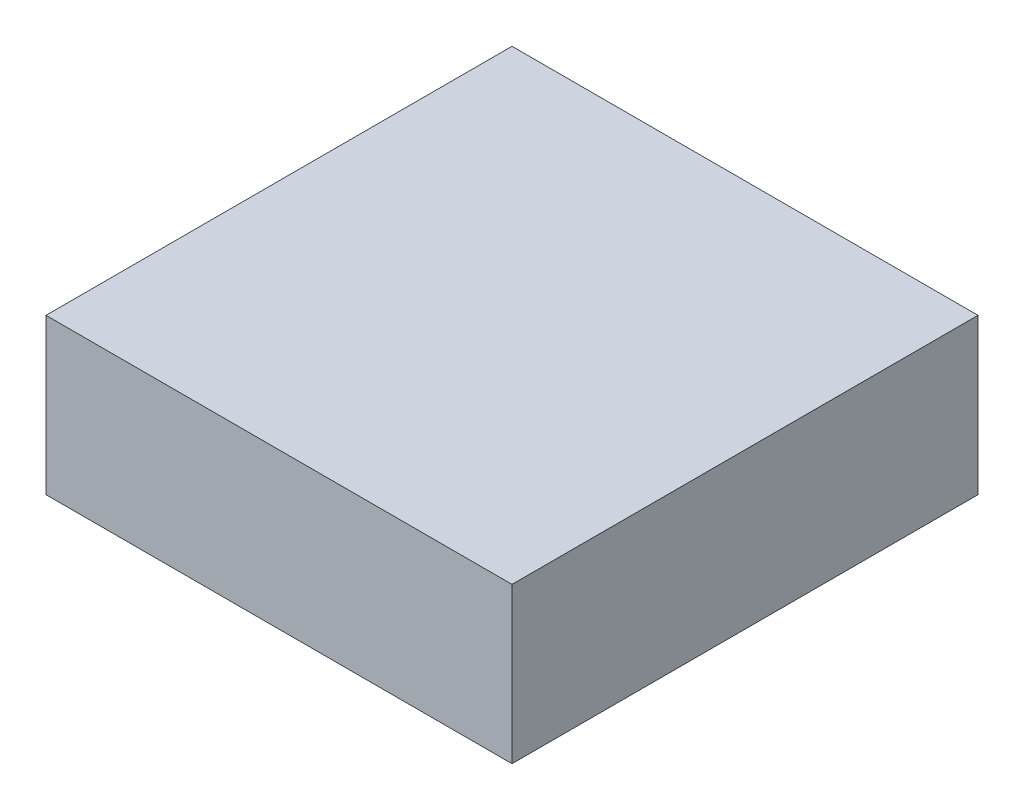
ISO-10303-21;
HEADER;
FILE_DESCRIPTION(('STEP AP214'),'2;1');
FILE_NAME('part.step','',(''),(''),'','','');
FILE_SCHEMA(('AUTOMOTIVE_DESIGN { 1 0 10303 214 1 1 1 1 }'));
ENDSEC;
DATA;
#1=APPLICATION_CONTEXT('core data for automotive mechanical design processes');
#2=APPLICATION_PROTOCOL_DEFINITION('international standard','automotive_design',2000,#1);
#3=PRODUCT_CONTEXT('',#1,'mechanical');
#4=PRODUCT('Part','Part','',(#3));
#5=PRODUCT_RELATED_PRODUCT_CATEGORY('part','',(#4));
#6=PRODUCT_DEFINITION_FORMATION('','',#4);
#7=PRODUCT_DEFINITION_CONTEXT('part definition',#1,'design');
#8=PRODUCT_DEFINITION('design','',#6,#7);
#9=PRODUCT_DEFINITION_SHAPE('','',#8);
#10=(LENGTH_UNIT() NAMED_UNIT(*) SI_UNIT(.MILLI.,.METRE.));
#11=(NAMED_UNIT(*) PLANE_ANGLE_UNIT() SI_UNIT($,.RADIAN.));
#12=(NAMED_UNIT(*) SI_UNIT($,.STERADIAN.) SOLID_ANGLE_UNIT());
#13=UNCERTAINTY_MEASURE_WITH_UNIT(LENGTH_MEASURE(1.E-05),#10,'distance_accuracy_value','');
#14=(GEOMETRIC_REPRESENTATION_CONTEXT(3) GLOBAL_UNCERTAINTY_ASSIGNED_CONTEXT((#13)) GLOBAL_UNIT_ASSIGNED_CONTEXT((#10,
#11,#12)) REPRESENTATION_CONTEXT('',''));
#15=CARTESIAN_POINT('',(0.,0.,0.));
#16=DIRECTION('',(0.,0.,1.));
#17=DIRECTION('',(1.,0.,0.));
#18=AXIS2_PLACEMENT_3D('',#15,#16,#17);
#19=CARTESIAN_POINT('',(15.,10.,-15.));
#20=DIRECTION('',(-1.,0.,0.));
#21=DIRECTION('',(0.,0.,1.));
#22=AXIS2_PLACEMENT_3D('',#19,#20,#21);
#23=PLANE('',#22);
#24=DIRECTION('',(0.,0.,-1.));
#25=VECTOR('',#24,1.);
#26=CARTESIAN_POINT('',(15.,0.,-15.));
#27=LINE('',#26,#25);
#28=CARTESIAN_POINT('',(15.,0.,15.));
#29=VERTEX_POINT('',#28);
#30=CARTESIAN_POINT('',(15.,0.,-15.));
#31=VERTEX_POINT('',#30);
#32=EDGE_CURVE('E98',#29,#31,#27,.T.);
#33=ORIENTED_EDGE('',*,*,#32,.T.);
#34=DIRECTION('',(0.,-1.,0.));
#35=VECTOR('',#34,1.);
#36=CARTESIAN_POINT('',(15.,10.,-15.));
#37=LINE('',#36,#35);
#38=CARTESIAN_POINT('',(15.,10.,-15.));
#39=VERTEX_POINT('',#38);
#40=EDGE_CURVE('E11',#39,#31,#37,.T.);
#41=ORIENTED_EDGE('',*,*,#40,.F.);
#42=DIRECTION('',(0.,0.,-1.));
#43=VECTOR('',#42,1.);
#44=CARTESIAN_POINT('',(15.,10.,-15.));
#45=LINE('',#44,#43);
#46=CARTESIAN_POINT('',(15.,10.,15.));
#47=VERTEX_POINT('',#46);
#48=EDGE_CURVE('E86',#47,#39,#45,.T.);
#49=ORIENTED_EDGE('',*,*,#48,.F.);
#50=DIRECTION('',(0.,-1.,0.));
#51=VECTOR('',#50,1.);
#52=CARTESIAN_POINT('',(15.,10.,15.));
#53=LINE('',#52,#51);
#54=EDGE_CURVE('E94',#47,#29,#53,.T.);
#55=ORIENTED_EDGE('',*,*,#54,.T.);
#56=EDGE_LOOP('',(#33,#41,#49,#55));
#57=FACE_BOUND('',#56,.T.);
#58=ADVANCED_FACE('F35',(#57),#23,.F.);
#59=CARTESIAN_POINT('',(-15.,10.,-15.));
#60=DIRECTION('',(0.,0.,1.));
#61=DIRECTION('',(1.,0.,0.));
#62=AXIS2_PLACEMENT_3D('',#59,#60,#61);
#63=PLANE('',#62);
#64=DIRECTION('',(-1.,0.,0.));
#65=VECTOR('',#64,1.);
#66=CARTESIAN_POINT('',(-15.,0.,-15.));
#67=LINE('',#66,#65);
#68=CARTESIAN_POINT('',(-15.,0.,-15.));
#69=VERTEX_POINT('',#68);
#70=EDGE_CURVE('E90',#31,#69,#67,.T.);
#71=ORIENTED_EDGE('',*,*,#70,.T.);
#72=DIRECTION('',(0.,-1.,0.));
#73=VECTOR('',#72,1.);
#74=CARTESIAN_POINT('',(-15.,10.,-15.));
#75=LINE('',#74,#73);
#76=CARTESIAN_POINT('',(-15.,10.,-15.));
#77=VERTEX_POINT('',#76);
#78=EDGE_CURVE('E43',#77,#69,#75,.T.);
#79=ORIENTED_EDGE('',*,*,#78,.F.);
#80=DIRECTION('',(-1.,0.,0.));
#81=VECTOR('',#80,1.);
#82=CARTESIAN_POINT('',(-15.,10.,-15.));
#83=LINE('',#82,#81);
#84=EDGE_CURVE('E81',#39,#77,#83,.T.);
#85=ORIENTED_EDGE('',*,*,#84,.F.);
#86=ORIENTED_EDGE('',*,*,#40,.T.);
#87=EDGE_LOOP('',(#71,#79,#85,#86));
#88=FACE_BOUND('',#87,.T.);
#89=ADVANCED_FACE('F89',(#88),#63,.F.);
#90=CARTESIAN_POINT('',(-15.,10.,-15.));
#91=DIRECTION('',(1.,0.,0.));
#92=DIRECTION('',(0.,0.,-1.));
#93=AXIS2_PLACEMENT_3D('',#90,#91,#92);
#94=PLANE('',#93);
#95=DIRECTION('',(0.,0.,1.));
#96=VECTOR('',#95,1.);
#97=CARTESIAN_POINT('',(-15.,0.,-15.));
#98=LINE('',#97,#96);
#99=CARTESIAN_POINT('',(-15.,0.,15.));
#100=VERTEX_POINT('',#99);
#101=EDGE_CURVE('E68',#69,#100,#98,.T.);
#102=ORIENTED_EDGE('',*,*,#101,.T.);
#103=DIRECTION('',(0.,-1.,0.));
#104=VECTOR('',#103,1.);
#105=CARTESIAN_POINT('',(-15.,10.,15.));
#106=LINE('',#105,#104);
#107=CARTESIAN_POINT('',(-15.,10.,15.));
#108=VERTEX_POINT('',#107);
#109=EDGE_CURVE('E91',#108,#100,#106,.T.);
#110=ORIENTED_EDGE('',*,*,#109,.F.);
#111=DIRECTION('',(0.,0.,1.));
#112=VECTOR('',#111,1.);
#113=CARTESIAN_POINT('',(-15.,10.,-15.));
#114=LINE('',#113,#112);
#115=EDGE_CURVE('E84',#77,#108,#114,.T.);
#116=ORIENTED_EDGE('',*,*,#115,.F.);
#117=ORIENTED_EDGE('',*,*,#78,.T.);
#118=EDGE_LOOP('',(#102,#110,#116,#117));
#119=FACE_BOUND('',#118,.T.);
#120=ADVANCED_FACE('F92',(#119),#94,.F.);
#121=CARTESIAN_POINT('',(-15.,10.,15.));
#122=DIRECTION('',(0.,0.,-1.));
#123=DIRECTION('',(-1.,0.,0.));
#124=AXIS2_PLACEMENT_3D('',#121,#122,#123);
#125=PLANE('',#124);
#126=DIRECTION('',(1.,0.,0.));
#127=VECTOR('',#126,1.);
#128=CARTESIAN_POINT('',(-15.,0.,15.));
#129=LINE('',#128,#127);
#130=EDGE_CURVE('E74',#100,#29,#129,.T.);
#131=ORIENTED_EDGE('',*,*,#130,.T.);
#132=ORIENTED_EDGE('',*,*,#54,.F.);
#133=DIRECTION('',(1.,0.,0.));
#134=VECTOR('',#133,1.);
#135=CARTESIAN_POINT('',(-15.,10.,15.));
#136=LINE('',#135,#134);
#137=EDGE_CURVE('E51',#108,#47,#136,.T.);
#138=ORIENTED_EDGE('',*,*,#137,.F.);
#139=ORIENTED_EDGE('',*,*,#109,.T.);
#140=EDGE_LOOP('',(#131,#132,#138,#139));
#141=FACE_BOUND('',#140,.T.);
#142=ADVANCED_FACE('F105',(#141),#125,.F.);
#143=CARTESIAN_POINT('',(0.,10.,0.));
#144=DIRECTION('',(0.,1.,0.));
#145=DIRECTION('',(0.,0.,1.));
#146=AXIS2_PLACEMENT_3D('',#143,#144,#145);
#147=PLANE('',#146);
#148=ORIENTED_EDGE('',*,*,#48,.T.);
#149=ORIENTED_EDGE('',*,*,#84,.T.);
#150=ORIENTED_EDGE('',*,*,#115,.T.);
#151=ORIENTED_EDGE('',*,*,#137,.T.);
#152=EDGE_LOOP('',(#148,#149,#150,#151));
#153=FACE_BOUND('',#152,.T.);
#154=ADVANCED_FACE('F82',(#153),#147,.T.);
#155=CARTESIAN_POINT('',(0.,0.,0.));
#156=DIRECTION('',(0.,1.,0.));
#157=DIRECTION('',(0.,0.,1.));
#158=AXIS2_PLACEMENT_3D('',#155,#156,#157);
#159=PLANE('',#158);
#160=ORIENTED_EDGE('',*,*,#32,.F.);
#161=ORIENTED_EDGE('',*,*,#130,.F.);
#162=ORIENTED_EDGE('',*,*,#101,.F.);
#163=ORIENTED_EDGE('',*,*,#70,.F.);
#164=EDGE_LOOP('',(#160,#161,#162,#163));
#165=FACE_BOUND('',#164,.T.);
#166=ADVANCED_FACE('F108',(#165),#159,.F.);
#167=CLOSED_SHELL('',(#58,#89,#120,#142,#154,#166));
#168=MANIFOLD_SOLID_BREP('B2',#167);
#169=ADVANCED_BREP_SHAPE_REPRESENTATION('',(#18,#168),#14);
#170=SHAPE_DEFINITION_REPRESENTATION(#9,#169);
ENDSEC;
END-ISO-10303-21;
